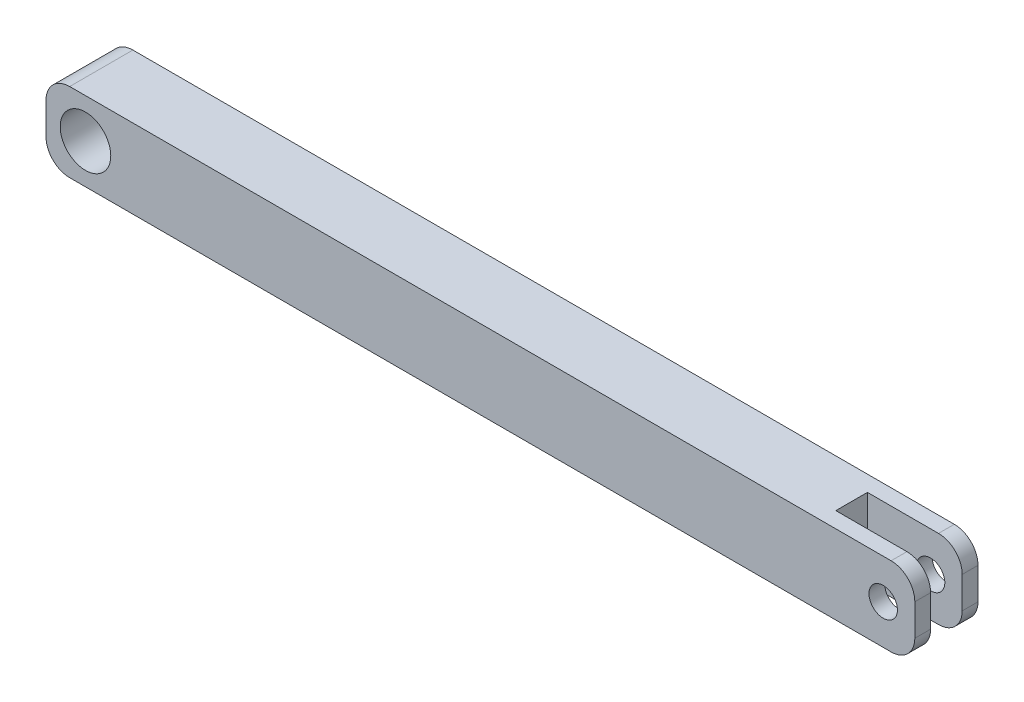
ISO-10303-21;
HEADER;
FILE_DESCRIPTION(('STEP AP214'),'2;1');
FILE_NAME('part.step','',(''),(''),'','','');
FILE_SCHEMA(('AUTOMOTIVE_DESIGN { 1 0 10303 214 1 1 1 1 }'));
ENDSEC;
DATA;
#1=APPLICATION_CONTEXT('core data for automotive mechanical design processes');
#2=APPLICATION_PROTOCOL_DEFINITION('international standard','automotive_design',2000,#1);
#3=PRODUCT_CONTEXT('',#1,'mechanical');
#4=PRODUCT('Part','Part','',(#3));
#5=PRODUCT_RELATED_PRODUCT_CATEGORY('part','',(#4));
#6=PRODUCT_DEFINITION_FORMATION('','',#4);
#7=PRODUCT_DEFINITION_CONTEXT('part definition',#1,'design');
#8=PRODUCT_DEFINITION('design','',#6,#7);
#9=PRODUCT_DEFINITION_SHAPE('','',#8);
#10=(LENGTH_UNIT() NAMED_UNIT(*) SI_UNIT(.MILLI.,.METRE.));
#11=(NAMED_UNIT(*) PLANE_ANGLE_UNIT() SI_UNIT($,.RADIAN.));
#12=(NAMED_UNIT(*) SI_UNIT($,.STERADIAN.) SOLID_ANGLE_UNIT());
#13=UNCERTAINTY_MEASURE_WITH_UNIT(LENGTH_MEASURE(1.E-05),#10,'distance_accuracy_value','');
#14=(GEOMETRIC_REPRESENTATION_CONTEXT(3) GLOBAL_UNCERTAINTY_ASSIGNED_CONTEXT((#13)) GLOBAL_UNIT_ASSIGNED_CONTEXT((#10,
#11,#12)) REPRESENTATION_CONTEXT('',''));
#15=CARTESIAN_POINT('',(0.,0.,0.));
#16=DIRECTION('',(0.,0.,1.));
#17=DIRECTION('',(1.,0.,0.));
#18=AXIS2_PLACEMENT_3D('',#15,#16,#17);
#19=CARTESIAN_POINT('',(55.,5.,3.));
#20=DIRECTION('',(-1.,0.,0.));
#21=DIRECTION('',(0.,0.,1.));
#22=AXIS2_PLACEMENT_3D('',#19,#20,#21);
#23=PLANE('',#22);
#24=DIRECTION('',(0.,0.,-1.));
#25=VECTOR('',#24,1.);
#26=CARTESIAN_POINT('',(55.,1.5,3.));
#27=LINE('',#26,#25);
#28=CARTESIAN_POINT('',(55.,1.5,3.5));
#29=VERTEX_POINT('',#28);
#30=CARTESIAN_POINT('',(55.,1.5,2.5));
#31=VERTEX_POINT('',#30);
#32=EDGE_CURVE('E254',#29,#31,#27,.T.);
#33=ORIENTED_EDGE('',*,*,#32,.T.);
#34=DIRECTION('',(0.,1.,0.));
#35=VECTOR('',#34,1.);
#36=CARTESIAN_POINT('',(55.,5.,2.5));
#37=LINE('',#36,#35);
#38=CARTESIAN_POINT('',(55.,3.5,2.5));
#39=VERTEX_POINT('',#38);
#40=EDGE_CURVE('E185',#31,#39,#37,.T.);
#41=ORIENTED_EDGE('',*,*,#40,.T.);
#42=DIRECTION('',(0.,0.,-1.));
#43=VECTOR('',#42,1.);
#44=CARTESIAN_POINT('',(55.,3.5,3.));
#45=LINE('',#44,#43);
#46=CARTESIAN_POINT('',(55.,3.5,3.5));
#47=VERTEX_POINT('',#46);
#48=EDGE_CURVE('E257',#39,#47,#45,.F.);
#49=ORIENTED_EDGE('',*,*,#48,.T.);
#50=DIRECTION('',(0.,1.,0.));
#51=VECTOR('',#50,1.);
#52=CARTESIAN_POINT('',(55.,1.5,3.5));
#53=LINE('',#52,#51);
#54=EDGE_CURVE('E232',#29,#47,#53,.T.);
#55=ORIENTED_EDGE('',*,*,#54,.F.);
#56=EDGE_LOOP('',(#33,#41,#49,#55));
#57=FACE_BOUND('',#56,.T.);
#58=ADVANCED_FACE('F41',(#57),#23,.F.);
#59=CARTESIAN_POINT('',(53.,2.5,3.001));
#60=DIRECTION('',(0.,0.,-1.));
#61=DIRECTION('',(-1.,0.,0.));
#62=AXIS2_PLACEMENT_3D('',#59,#60,#61);
#63=CYLINDRICAL_SURFACE('',#62,0.900000000000004);
#64=CARTESIAN_POINT('',(53.,2.5,2.5));
#65=DIRECTION('',(0.,0.,1.));
#66=DIRECTION('',(1.,0.,0.));
#67=AXIS2_PLACEMENT_3D('',#64,#65,#66);
#68=CIRCLE('',#67,0.900000000000004);
#69=CARTESIAN_POINT('',(53.9,2.5,2.5));
#70=VERTEX_POINT('',#69);
#71=EDGE_CURVE('E190',#70,#70,#68,.T.);
#72=ORIENTED_EDGE('',*,*,#71,.F.);
#73=EDGE_LOOP('',(#72));
#74=FACE_BOUND('',#73,.T.);
#75=CARTESIAN_POINT('',(53.,2.5,3.5));
#76=DIRECTION('',(0.,0.,1.));
#77=DIRECTION('',(1.,0.,0.));
#78=AXIS2_PLACEMENT_3D('',#75,#76,#77);
#79=CIRCLE('',#78,0.900000000000004);
#80=CARTESIAN_POINT('',(53.9,2.5,3.5));
#81=VERTEX_POINT('',#80);
#82=EDGE_CURVE('E223',#81,#81,#79,.T.);
#83=ORIENTED_EDGE('',*,*,#82,.T.);
#84=EDGE_LOOP('',(#83));
#85=FACE_BOUND('',#84,.T.);
#86=ADVANCED_FACE('F320',(#74,#85),#63,.F.);
#87=CARTESIAN_POINT('',(53.5,3.5,0.));
#88=DIRECTION('',(0.,0.,1.));
#89=DIRECTION('',(1.,0.,0.));
#90=AXIS2_PLACEMENT_3D('',#87,#88,#89);
#91=CYLINDRICAL_SURFACE('',#90,1.5);
#92=CARTESIAN_POINT('',(53.5,3.5,2.5));
#93=DIRECTION('',(0.,0.,1.));
#94=DIRECTION('',(1.,0.,0.));
#95=AXIS2_PLACEMENT_3D('',#92,#93,#94);
#96=CIRCLE('',#95,1.5);
#97=CARTESIAN_POINT('',(53.5,5.,2.5));
#98=VERTEX_POINT('',#97);
#99=EDGE_CURVE('E188',#98,#39,#96,.F.);
#100=ORIENTED_EDGE('',*,*,#99,.F.);
#101=DIRECTION('',(0.,0.,-1.));
#102=VECTOR('',#101,1.);
#103=CARTESIAN_POINT('',(53.5,5.,0.));
#104=LINE('',#103,#102);
#105=CARTESIAN_POINT('',(53.5,5.,3.5));
#106=VERTEX_POINT('',#105);
#107=EDGE_CURVE('E167',#106,#98,#104,.T.);
#108=ORIENTED_EDGE('',*,*,#107,.F.);
#109=CARTESIAN_POINT('',(53.5,3.5,3.5));
#110=DIRECTION('',(0.,0.,1.));
#111=DIRECTION('',(1.,0.,0.));
#112=AXIS2_PLACEMENT_3D('',#109,#110,#111);
#113=CIRCLE('',#112,1.5);
#114=EDGE_CURVE('E235',#47,#106,#113,.T.);
#115=ORIENTED_EDGE('',*,*,#114,.F.);
#116=ORIENTED_EDGE('',*,*,#48,.F.);
#117=EDGE_LOOP('',(#100,#108,#115,#116));
#118=FACE_BOUND('',#117,.T.);
#119=ADVANCED_FACE('F298',(#118),#91,.T.);
#120=CARTESIAN_POINT('',(53.5,1.5,3.));
#121=DIRECTION('',(0.,0.,-1.));
#122=DIRECTION('',(-1.,0.,0.));
#123=AXIS2_PLACEMENT_3D('',#120,#121,#122);
#124=CYLINDRICAL_SURFACE('',#123,1.5);
#125=CARTESIAN_POINT('',(53.5,1.5,2.5));
#126=DIRECTION('',(0.,0.,1.));
#127=DIRECTION('',(1.,0.,0.));
#128=AXIS2_PLACEMENT_3D('',#125,#126,#127);
#129=CIRCLE('',#128,1.5);
#130=CARTESIAN_POINT('',(53.5,0.,2.5));
#131=VERTEX_POINT('',#130);
#132=EDGE_CURVE('E183',#31,#131,#129,.F.);
#133=ORIENTED_EDGE('',*,*,#132,.F.);
#134=ORIENTED_EDGE('',*,*,#32,.F.);
#135=CARTESIAN_POINT('',(53.5,1.5,3.5));
#136=DIRECTION('',(0.,0.,1.));
#137=DIRECTION('',(1.,0.,0.));
#138=AXIS2_PLACEMENT_3D('',#135,#136,#137);
#139=CIRCLE('',#138,1.5);
#140=CARTESIAN_POINT('',(53.5,0.,3.5));
#141=VERTEX_POINT('',#140);
#142=EDGE_CURVE('E229',#141,#29,#139,.T.);
#143=ORIENTED_EDGE('',*,*,#142,.F.);
#144=DIRECTION('',(0.,0.,-1.));
#145=VECTOR('',#144,1.);
#146=CARTESIAN_POINT('',(53.5,0.,0.));
#147=LINE('',#146,#145);
#148=EDGE_CURVE('E55',#131,#141,#147,.F.);
#149=ORIENTED_EDGE('',*,*,#148,.F.);
#150=EDGE_LOOP('',(#133,#134,#143,#149));
#151=FACE_BOUND('',#150,.T.);
#152=ADVANCED_FACE('F292',(#151),#124,.T.);
#153=CARTESIAN_POINT('',(0.,5.,0.));
#154=DIRECTION('',(1.,0.,0.));
#155=DIRECTION('',(0.,0.,-1.));
#156=AXIS2_PLACEMENT_3D('',#153,#154,#155);
#157=PLANE('',#156);
#158=DIRECTION('',(0.,0.,1.));
#159=VECTOR('',#158,1.);
#160=CARTESIAN_POINT('',(0.,3.5,0.));
#161=LINE('',#160,#159);
#162=CARTESIAN_POINT('',(0.,3.5,3.5));
#163=VERTEX_POINT('',#162);
#164=CARTESIAN_POINT('',(0.,3.5,-0.5));
#165=VERTEX_POINT('',#164);
#166=EDGE_CURVE('E265',#163,#165,#161,.F.);
#167=ORIENTED_EDGE('',*,*,#166,.T.);
#168=DIRECTION('',(0.,1.,0.));
#169=VECTOR('',#168,1.);
#170=CARTESIAN_POINT('',(0.,1.5,-0.5));
#171=LINE('',#170,#169);
#172=CARTESIAN_POINT('',(0.,1.5,-0.5));
#173=VERTEX_POINT('',#172);
#174=EDGE_CURVE('E220',#173,#165,#171,.T.);
#175=ORIENTED_EDGE('',*,*,#174,.F.);
#176=DIRECTION('',(0.,0.,1.));
#177=VECTOR('',#176,1.);
#178=CARTESIAN_POINT('',(0.,1.5,0.));
#179=LINE('',#178,#177);
#180=CARTESIAN_POINT('',(0.,1.5,3.5));
#181=VERTEX_POINT('',#180);
#182=EDGE_CURVE('E267',#173,#181,#179,.T.);
#183=ORIENTED_EDGE('',*,*,#182,.T.);
#184=DIRECTION('',(0.,-1.,0.));
#185=VECTOR('',#184,1.);
#186=CARTESIAN_POINT('',(0.,3.5,3.5));
#187=LINE('',#186,#185);
#188=EDGE_CURVE('E244',#163,#181,#187,.T.);
#189=ORIENTED_EDGE('',*,*,#188,.F.);
#190=EDGE_LOOP('',(#167,#175,#183,#189));
#191=FACE_BOUND('',#190,.T.);
#192=ADVANCED_FACE('F310',(#191),#157,.F.);
#193=CARTESIAN_POINT('',(55.,3.5,-0.500000000000004));
#194=VERTEX_POINT('',#193);
#195=CARTESIAN_POINT('',(55.,3.5,0.5));
#196=VERTEX_POINT('',#195);
#197=EDGE_CURVE('E258',#194,#196,#45,.F.);
#198=ORIENTED_EDGE('',*,*,#197,.T.);
#199=DIRECTION('',(0.,-1.,0.));
#200=VECTOR('',#199,1.);
#201=CARTESIAN_POINT('',(55.,5.,0.5));
#202=LINE('',#201,#200);
#203=CARTESIAN_POINT('',(55.,1.5,0.500000000000001));
#204=VERTEX_POINT('',#203);
#205=EDGE_CURVE('E175',#196,#204,#202,.T.);
#206=ORIENTED_EDGE('',*,*,#205,.T.);
#207=CARTESIAN_POINT('',(55.,1.5,-0.500000000000004));
#208=VERTEX_POINT('',#207);
#209=EDGE_CURVE('E253',#204,#208,#27,.T.);
#210=ORIENTED_EDGE('',*,*,#209,.T.);
#211=DIRECTION('',(0.,-1.,0.));
#212=VECTOR('',#211,1.);
#213=CARTESIAN_POINT('',(55.,3.5,-0.500000000000004));
#214=LINE('',#213,#212);
#215=EDGE_CURVE('E208',#194,#208,#214,.T.);
#216=ORIENTED_EDGE('',*,*,#215,.F.);
#217=EDGE_LOOP('',(#198,#206,#210,#216));
#218=FACE_BOUND('',#217,.T.);
#219=ADVANCED_FACE('F277',(#218),#23,.F.);
#220=CARTESIAN_POINT('',(0.,5.,0.));
#221=DIRECTION('',(0.,1.,0.));
#222=DIRECTION('',(0.,0.,1.));
#223=AXIS2_PLACEMENT_3D('',#220,#221,#222);
#224=PLANE('',#223);
#225=DIRECTION('',(0.,0.,1.));
#226=VECTOR('',#225,1.);
#227=CARTESIAN_POINT('',(49.,5.,0.700000000000001));
#228=LINE('',#227,#226);
#229=CARTESIAN_POINT('',(49.,5.,0.500000000000001));
#230=VERTEX_POINT('',#229);
#231=CARTESIAN_POINT('',(49.,5.,2.5));
#232=VERTEX_POINT('',#231);
#233=EDGE_CURVE('E144',#230,#232,#228,.T.);
#234=ORIENTED_EDGE('',*,*,#233,.F.);
#235=DIRECTION('',(-1.,0.,0.));
#236=VECTOR('',#235,1.);
#237=CARTESIAN_POINT('',(55.9534965115397,5.,0.5));
#238=LINE('',#237,#236);
#239=CARTESIAN_POINT('',(53.5,5.,0.500000000000001));
#240=VERTEX_POINT('',#239);
#241=EDGE_CURVE('E162',#240,#230,#238,.T.);
#242=ORIENTED_EDGE('',*,*,#241,.F.);
#243=CARTESIAN_POINT('',(53.5,5.,-0.500000000000004));
#244=VERTEX_POINT('',#243);
#245=EDGE_CURVE('E251',#240,#244,#104,.T.);
#246=ORIENTED_EDGE('',*,*,#245,.T.);
#247=DIRECTION('',(1.,0.,0.));
#248=VECTOR('',#247,1.);
#249=CARTESIAN_POINT('',(1.5,5.,-0.5));
#250=LINE('',#249,#248);
#251=CARTESIAN_POINT('',(1.5,5.,-0.5));
#252=VERTEX_POINT('',#251);
#253=EDGE_CURVE('E202',#252,#244,#250,.T.);
#254=ORIENTED_EDGE('',*,*,#253,.F.);
#255=DIRECTION('',(0.,0.,1.));
#256=VECTOR('',#255,1.);
#257=CARTESIAN_POINT('',(1.5,5.,3.));
#258=LINE('',#257,#256);
#259=CARTESIAN_POINT('',(1.5,5.,3.5));
#260=VERTEX_POINT('',#259);
#261=EDGE_CURVE('E154',#252,#260,#258,.T.);
#262=ORIENTED_EDGE('',*,*,#261,.T.);
#263=DIRECTION('',(-1.,0.,0.));
#264=VECTOR('',#263,1.);
#265=CARTESIAN_POINT('',(53.5,5.,3.5));
#266=LINE('',#265,#264);
#267=EDGE_CURVE('E238',#106,#260,#266,.T.);
#268=ORIENTED_EDGE('',*,*,#267,.F.);
#269=ORIENTED_EDGE('',*,*,#107,.T.);
#270=DIRECTION('',(1.,0.,0.));
#271=VECTOR('',#270,1.);
#272=CARTESIAN_POINT('',(55.9534965115397,5.,2.5));
#273=LINE('',#272,#271);
#274=EDGE_CURVE('E160',#232,#98,#273,.T.);
#275=ORIENTED_EDGE('',*,*,#274,.F.);
#276=EDGE_LOOP('',(#234,#242,#246,#254,#262,#268,#269,#275));
#277=FACE_BOUND('',#276,.T.);
#278=ADVANCED_FACE('F165',(#277),#224,.T.);
#279=CARTESIAN_POINT('',(0.,0.,0.));
#280=DIRECTION('',(0.,1.,0.));
#281=DIRECTION('',(0.,0.,1.));
#282=AXIS2_PLACEMENT_3D('',#279,#280,#281);
#283=PLANE('',#282);
#284=DIRECTION('',(-1.,0.,0.));
#285=VECTOR('',#284,1.);
#286=CARTESIAN_POINT('',(0.,0.,0.500000000000007));
#287=LINE('',#286,#285);
#288=CARTESIAN_POINT('',(53.5,0.,0.500000000000001));
#289=VERTEX_POINT('',#288);
#290=CARTESIAN_POINT('',(49.,0.,0.500000000000001));
#291=VERTEX_POINT('',#290);
#292=EDGE_CURVE('E171',#289,#291,#287,.T.);
#293=ORIENTED_EDGE('',*,*,#292,.T.);
#294=DIRECTION('',(0.,0.,1.));
#295=VECTOR('',#294,1.);
#296=CARTESIAN_POINT('',(49.,0.,0.));
#297=LINE('',#296,#295);
#298=CARTESIAN_POINT('',(49.,0.,2.5));
#299=VERTEX_POINT('',#298);
#300=EDGE_CURVE('E269',#291,#299,#297,.T.);
#301=ORIENTED_EDGE('',*,*,#300,.T.);
#302=DIRECTION('',(1.,0.,0.));
#303=VECTOR('',#302,1.);
#304=CARTESIAN_POINT('',(0.,0.,2.50000000000001));
#305=LINE('',#304,#303);
#306=EDGE_CURVE('E11',#299,#131,#305,.T.);
#307=ORIENTED_EDGE('',*,*,#306,.T.);
#308=ORIENTED_EDGE('',*,*,#148,.T.);
#309=DIRECTION('',(1.,0.,0.));
#310=VECTOR('',#309,1.);
#311=CARTESIAN_POINT('',(1.5,0.,3.5));
#312=LINE('',#311,#310);
#313=CARTESIAN_POINT('',(1.5,0.,3.5));
#314=VERTEX_POINT('',#313);
#315=EDGE_CURVE('E155',#314,#141,#312,.T.);
#316=ORIENTED_EDGE('',*,*,#315,.F.);
#317=DIRECTION('',(0.,0.,1.));
#318=VECTOR('',#317,1.);
#319=CARTESIAN_POINT('',(1.5,0.,0.));
#320=LINE('',#319,#318);
#321=CARTESIAN_POINT('',(1.5,0.,-0.5));
#322=VERTEX_POINT('',#321);
#323=EDGE_CURVE('E63',#314,#322,#320,.F.);
#324=ORIENTED_EDGE('',*,*,#323,.T.);
#325=DIRECTION('',(-1.,0.,0.));
#326=VECTOR('',#325,1.);
#327=CARTESIAN_POINT('',(53.5,0.,-0.500000000000004));
#328=LINE('',#327,#326);
#329=CARTESIAN_POINT('',(53.5,0.,-0.500000000000004));
#330=VERTEX_POINT('',#329);
#331=EDGE_CURVE('E214',#330,#322,#328,.T.);
#332=ORIENTED_EDGE('',*,*,#331,.F.);
#333=EDGE_CURVE('E262',#330,#289,#147,.F.);
#334=ORIENTED_EDGE('',*,*,#333,.T.);
#335=EDGE_LOOP('',(#293,#301,#307,#308,#316,#324,#332,#334));
#336=FACE_BOUND('',#335,.T.);
#337=ADVANCED_FACE('F285',(#336),#283,.F.);
#338=CARTESIAN_POINT('',(2.5,2.5,-0.00100000000000013));
#339=DIRECTION('',(0.,0.,1.));
#340=DIRECTION('',(1.,0.,0.));
#341=AXIS2_PLACEMENT_3D('',#338,#339,#340);
#342=CYLINDRICAL_SURFACE('',#341,1.6);
#343=CARTESIAN_POINT('',(2.5,2.5,3.5));
#344=DIRECTION('',(0.,0.,1.));
#345=DIRECTION('',(1.,0.,0.));
#346=AXIS2_PLACEMENT_3D('',#343,#344,#345);
#347=CIRCLE('',#346,1.6);
#348=CARTESIAN_POINT('',(4.1,2.5,3.5));
#349=VERTEX_POINT('',#348);
#350=EDGE_CURVE('E226',#349,#349,#347,.T.);
#351=CARTESIAN_POINT('',(2.5,2.5,-0.5));
#352=DIRECTION('',(0.,0.,-1.));
#353=DIRECTION('',(-1.,0.,0.));
#354=AXIS2_PLACEMENT_3D('',#351,#352,#353);
#355=CIRCLE('',#354,1.6);
#356=CARTESIAN_POINT('',(4.1,2.5,-0.5));
#357=VERTEX_POINT('',#356);
#358=EDGE_CURVE('E193',#357,#357,#355,.T.);
#359=CARTESIAN_POINT('',(4.1,2.5,3.5));
#360=CARTESIAN_POINT('',(4.1,2.5,3.45833333333333));
#361=CARTESIAN_POINT('',(4.1,2.5,3.41666666666667));
#362=CARTESIAN_POINT('',(4.1,2.5,3.33333333333333));
#363=CARTESIAN_POINT('',(4.1,2.5,3.29166666666667));
#364=CARTESIAN_POINT('',(4.1,2.5,3.20833333333333));
#365=CARTESIAN_POINT('',(4.1,2.5,3.16666666666667));
#366=CARTESIAN_POINT('',(4.1,2.5,3.08333333333333));
#367=CARTESIAN_POINT('',(4.1,2.5,3.04166666666667));
#368=CARTESIAN_POINT('',(4.1,2.5,2.95833333333333));
#369=CARTESIAN_POINT('',(4.1,2.5,2.91666666666667));
#370=CARTESIAN_POINT('',(4.1,2.5,2.83333333333333));
#371=CARTESIAN_POINT('',(4.1,2.5,2.79166666666667));
#372=CARTESIAN_POINT('',(4.1,2.5,2.70833333333333));
#373=CARTESIAN_POINT('',(4.1,2.5,2.66666666666667));
#374=CARTESIAN_POINT('',(4.1,2.5,2.58333333333333));
#375=CARTESIAN_POINT('',(4.1,2.5,2.54166666666667));
#376=CARTESIAN_POINT('',(4.1,2.5,2.45833333333333));
#377=CARTESIAN_POINT('',(4.1,2.5,2.41666666666667));
#378=CARTESIAN_POINT('',(4.1,2.5,2.33333333333333));
#379=CARTESIAN_POINT('',(4.1,2.5,2.29166666666667));
#380=CARTESIAN_POINT('',(4.1,2.5,2.20833333333333));
#381=CARTESIAN_POINT('',(4.1,2.5,2.16666666666667));
#382=CARTESIAN_POINT('',(4.1,2.5,2.08333333333333));
#383=CARTESIAN_POINT('',(4.1,2.5,2.04166666666667));
#384=CARTESIAN_POINT('',(4.1,2.5,1.95833333333333));
#385=CARTESIAN_POINT('',(4.1,2.5,1.91666666666667));
#386=CARTESIAN_POINT('',(4.1,2.5,1.83333333333333));
#387=CARTESIAN_POINT('',(4.1,2.5,1.79166666666667));
#388=CARTESIAN_POINT('',(4.1,2.5,1.70833333333333));
#389=CARTESIAN_POINT('',(4.1,2.5,1.66666666666667));
#390=CARTESIAN_POINT('',(4.1,2.5,1.58333333333333));
#391=CARTESIAN_POINT('',(4.1,2.5,1.54166666666667));
#392=CARTESIAN_POINT('',(4.1,2.5,1.45833333333333));
#393=CARTESIAN_POINT('',(4.1,2.5,1.41666666666667));
#394=CARTESIAN_POINT('',(4.1,2.5,1.33333333333333));
#395=CARTESIAN_POINT('',(4.1,2.5,1.29166666666667));
#396=CARTESIAN_POINT('',(4.1,2.5,1.20833333333333));
#397=CARTESIAN_POINT('',(4.1,2.5,1.16666666666667));
#398=CARTESIAN_POINT('',(4.1,2.5,1.08333333333333));
#399=CARTESIAN_POINT('',(4.1,2.5,1.04166666666667));
#400=CARTESIAN_POINT('',(4.1,2.5,0.958333333333333));
#401=CARTESIAN_POINT('',(4.1,2.5,0.916666666666666));
#402=CARTESIAN_POINT('',(4.1,2.5,0.833333333333333));
#403=CARTESIAN_POINT('',(4.1,2.5,0.791666666666666));
#404=CARTESIAN_POINT('',(4.1,2.5,0.708333333333333));
#405=CARTESIAN_POINT('',(4.1,2.5,0.666666666666666));
#406=CARTESIAN_POINT('',(4.1,2.5,0.583333333333333));
#407=CARTESIAN_POINT('',(4.1,2.5,0.541666666666666));
#408=CARTESIAN_POINT('',(4.1,2.5,0.458333333333333));
#409=CARTESIAN_POINT('',(4.1,2.5,0.416666666666666));
#410=CARTESIAN_POINT('',(4.1,2.5,0.333333333333333));
#411=CARTESIAN_POINT('',(4.1,2.5,0.291666666666666));
#412=CARTESIAN_POINT('',(4.1,2.5,0.208333333333333));
#413=CARTESIAN_POINT('',(4.1,2.5,0.166666666666666));
#414=CARTESIAN_POINT('',(4.1,2.5,0.083333333333333));
#415=CARTESIAN_POINT('',(4.1,2.5,0.0416666666666663));
#416=CARTESIAN_POINT('',(4.1,2.5,-0.0416666666666671));
#417=CARTESIAN_POINT('',(4.1,2.5,-0.0833333333333338));
#418=CARTESIAN_POINT('',(4.1,2.5,-0.166666666666667));
#419=CARTESIAN_POINT('',(4.1,2.5,-0.208333333333334));
#420=CARTESIAN_POINT('',(4.1,2.5,-0.291666666666667));
#421=CARTESIAN_POINT('',(4.1,2.5,-0.333333333333334));
#422=CARTESIAN_POINT('',(4.1,2.5,-0.416666666666667));
#423=CARTESIAN_POINT('',(4.1,2.5,-0.458333333333334));
#424=CARTESIAN_POINT('',(4.1,2.5,-0.5));
#425=B_SPLINE_CURVE_WITH_KNOTS('',3,(#359,#360,#361,#362,#363,#364,#365,#366,#367,#368,#369,
#370,#371,#372,#373,#374,#375,#376,#377,#378,#379,#380,#381,#382,#383,#384,#385,#386,#387,#388,
#389,#390,#391,#392,#393,#394,#395,#396,#397,#398,#399,#400,#401,#402,#403,#404,#405,#406,#407,
#408,#409,#410,#411,#412,#413,#414,#415,#416,#417,#418,#419,#420,#421,#422,#423,#424),
.UNSPECIFIED.,.F.,.F.,(4,2,2,2,2,2,2,2,2,2,2,2,2,2,2,2,2,2,2,2,2,2,2,2,2,2,2,2,2,2,2,2,4),(0.,
0.125,0.25,0.375,0.5,0.625,0.75,0.875,1.,1.125,1.25,1.375,1.5,1.625,1.75,1.875,2.,2.125,2.25,
2.375,2.5,2.625,2.75,2.875,3.,3.125,3.25,3.375,3.5,3.625,3.75,3.875,4.),.UNSPECIFIED.);
#426=EDGE_CURVE('BSEAM346',#349,#357,#425,.T.);
#427=ORIENTED_EDGE('',*,*,#350,.T.);
#428=ORIENTED_EDGE('',*,*,#358,.T.);
#429=ORIENTED_EDGE('',*,*,#426,.T.);
#430=ORIENTED_EDGE('',*,*,#426,.F.);
#431=EDGE_LOOP('',(#427,#429,#428,#430));
#432=FACE_BOUND('',#431,.T.);
#433=ADVANCED_FACE('F346',(#432),#342,.F.);
#434=CARTESIAN_POINT('',(53.,2.5,0.500000000000001));
#435=DIRECTION('',(0.,0.,-1.));
#436=DIRECTION('',(-1.,0.,0.));
#437=AXIS2_PLACEMENT_3D('',#434,#435,#436);
#438=CIRCLE('',#437,0.900000000000004);
#439=CARTESIAN_POINT('',(52.1,2.5,0.500000000000001));
#440=VERTEX_POINT('',#439);
#441=EDGE_CURVE('E180',#440,#440,#438,.T.);
#442=ORIENTED_EDGE('',*,*,#441,.F.);
#443=EDGE_LOOP('',(#442));
#444=FACE_BOUND('',#443,.T.);
#445=CARTESIAN_POINT('',(53.,2.5,-0.500000000000004));
#446=DIRECTION('',(0.,0.,-1.));
#447=DIRECTION('',(-1.,0.,0.));
#448=AXIS2_PLACEMENT_3D('',#445,#446,#447);
#449=CIRCLE('',#448,0.900000000000004);
#450=CARTESIAN_POINT('',(52.1,2.5,-0.500000000000004));
#451=VERTEX_POINT('',#450);
#452=EDGE_CURVE('E196',#451,#451,#449,.T.);
#453=ORIENTED_EDGE('',*,*,#452,.T.);
#454=EDGE_LOOP('',(#453));
#455=FACE_BOUND('',#454,.T.);
#456=ADVANCED_FACE('F328',(#444,#455),#63,.F.);
#457=CARTESIAN_POINT('',(53.5,3.5,0.500000000000001));
#458=DIRECTION('',(0.,0.,-1.));
#459=DIRECTION('',(-1.,0.,0.));
#460=AXIS2_PLACEMENT_3D('',#457,#458,#459);
#461=CIRCLE('',#460,1.5);
#462=EDGE_CURVE('E178',#196,#240,#461,.F.);
#463=ORIENTED_EDGE('',*,*,#462,.F.);
#464=ORIENTED_EDGE('',*,*,#197,.F.);
#465=CARTESIAN_POINT('',(53.5,3.5,-0.500000000000004));
#466=DIRECTION('',(0.,0.,-1.));
#467=DIRECTION('',(-1.,0.,0.));
#468=AXIS2_PLACEMENT_3D('',#465,#466,#467);
#469=CIRCLE('',#468,1.5);
#470=EDGE_CURVE('E205',#244,#194,#469,.T.);
#471=ORIENTED_EDGE('',*,*,#470,.F.);
#472=ORIENTED_EDGE('',*,*,#245,.F.);
#473=EDGE_LOOP('',(#463,#464,#471,#472));
#474=FACE_BOUND('',#473,.T.);
#475=ADVANCED_FACE('F303',(#474),#91,.T.);
#476=CARTESIAN_POINT('',(53.5,1.5,0.500000000000001));
#477=DIRECTION('',(0.,0.,-1.));
#478=DIRECTION('',(-1.,0.,0.));
#479=AXIS2_PLACEMENT_3D('',#476,#477,#478);
#480=CIRCLE('',#479,1.5);
#481=EDGE_CURVE('E49',#289,#204,#480,.F.);
#482=ORIENTED_EDGE('',*,*,#481,.F.);
#483=ORIENTED_EDGE('',*,*,#333,.F.);
#484=CARTESIAN_POINT('',(53.5,1.5,-0.500000000000004));
#485=DIRECTION('',(0.,0.,-1.));
#486=DIRECTION('',(-1.,0.,0.));
#487=AXIS2_PLACEMENT_3D('',#484,#485,#486);
#488=CIRCLE('',#487,1.5);
#489=EDGE_CURVE('E211',#208,#330,#488,.T.);
#490=ORIENTED_EDGE('',*,*,#489,.F.);
#491=ORIENTED_EDGE('',*,*,#209,.F.);
#492=EDGE_LOOP('',(#482,#483,#490,#491));
#493=FACE_BOUND('',#492,.T.);
#494=ADVANCED_FACE('F280',(#493),#124,.T.);
#495=CARTESIAN_POINT('',(1.5,1.5,0.));
#496=DIRECTION('',(0.,0.,1.));
#497=DIRECTION('',(1.,0.,0.));
#498=AXIS2_PLACEMENT_3D('',#495,#496,#497);
#499=CYLINDRICAL_SURFACE('',#498,1.5);
#500=ORIENTED_EDGE('',*,*,#182,.F.);
#501=CARTESIAN_POINT('',(1.5,1.5,-0.5));
#502=DIRECTION('',(0.,0.,-1.));
#503=DIRECTION('',(-1.,0.,0.));
#504=AXIS2_PLACEMENT_3D('',#501,#502,#503);
#505=CIRCLE('',#504,1.5);
#506=EDGE_CURVE('E217',#322,#173,#505,.T.);
#507=ORIENTED_EDGE('',*,*,#506,.F.);
#508=ORIENTED_EDGE('',*,*,#323,.F.);
#509=CARTESIAN_POINT('',(1.5,1.5,3.5));
#510=DIRECTION('',(0.,0.,1.));
#511=DIRECTION('',(1.,0.,0.));
#512=AXIS2_PLACEMENT_3D('',#509,#510,#511);
#513=CIRCLE('',#512,1.5);
#514=EDGE_CURVE('E247',#181,#314,#513,.T.);
#515=ORIENTED_EDGE('',*,*,#514,.F.);
#516=EDGE_LOOP('',(#500,#507,#508,#515));
#517=FACE_BOUND('',#516,.T.);
#518=ADVANCED_FACE('F311',(#517),#499,.T.);
#519=CARTESIAN_POINT('',(1.5,3.5,0.));
#520=DIRECTION('',(0.,0.,-1.));
#521=DIRECTION('',(-1.,0.,0.));
#522=AXIS2_PLACEMENT_3D('',#519,#520,#521);
#523=CYLINDRICAL_SURFACE('',#522,1.5);
#524=ORIENTED_EDGE('',*,*,#261,.F.);
#525=CARTESIAN_POINT('',(1.5,3.5,-0.5));
#526=DIRECTION('',(0.,0.,-1.));
#527=DIRECTION('',(-1.,0.,0.));
#528=AXIS2_PLACEMENT_3D('',#525,#526,#527);
#529=CIRCLE('',#528,1.5);
#530=EDGE_CURVE('E199',#165,#252,#529,.T.);
#531=ORIENTED_EDGE('',*,*,#530,.F.);
#532=ORIENTED_EDGE('',*,*,#166,.F.);
#533=CARTESIAN_POINT('',(1.5,3.5,3.5));
#534=DIRECTION('',(0.,0.,1.));
#535=DIRECTION('',(1.,0.,0.));
#536=AXIS2_PLACEMENT_3D('',#533,#534,#535);
#537=CIRCLE('',#536,1.5);
#538=EDGE_CURVE('E241',#260,#163,#537,.T.);
#539=ORIENTED_EDGE('',*,*,#538,.F.);
#540=EDGE_LOOP('',(#524,#531,#532,#539));
#541=FACE_BOUND('',#540,.T.);
#542=ADVANCED_FACE('F43',(#541),#523,.T.);
#543=CARTESIAN_POINT('',(49.,-5.,0.700000000000001));
#544=DIRECTION('',(-1.,0.,0.));
#545=DIRECTION('',(0.,0.,1.));
#546=AXIS2_PLACEMENT_3D('',#543,#544,#545);
#547=PLANE('',#546);
#548=ORIENTED_EDGE('',*,*,#300,.F.);
#549=DIRECTION('',(0.,1.,0.));
#550=VECTOR('',#549,1.);
#551=CARTESIAN_POINT('',(49.,-5.,0.500000000000001));
#552=LINE('',#551,#550);
#553=EDGE_CURVE('E149',#291,#230,#552,.T.);
#554=ORIENTED_EDGE('',*,*,#553,.T.);
#555=ORIENTED_EDGE('',*,*,#233,.T.);
#556=DIRECTION('',(0.,1.,0.));
#557=VECTOR('',#556,1.);
#558=CARTESIAN_POINT('',(49.,-5.,2.5));
#559=LINE('',#558,#557);
#560=EDGE_CURVE('E147',#299,#232,#559,.T.);
#561=ORIENTED_EDGE('',*,*,#560,.F.);
#562=EDGE_LOOP('',(#548,#554,#555,#561));
#563=FACE_BOUND('',#562,.T.);
#564=ADVANCED_FACE('F146',(#563),#547,.F.);
#565=CARTESIAN_POINT('',(53.5,1.5,3.5));
#566=DIRECTION('',(0.,0.,1.));
#567=DIRECTION('',(1.,0.,0.));
#568=AXIS2_PLACEMENT_3D('',#565,#566,#567);
#569=PLANE('',#568);
#570=ORIENTED_EDGE('',*,*,#350,.F.);
#571=EDGE_LOOP('',(#570));
#572=FACE_BOUND('',#571,.T.);
#573=ORIENTED_EDGE('',*,*,#142,.T.);
#574=ORIENTED_EDGE('',*,*,#54,.T.);
#575=ORIENTED_EDGE('',*,*,#114,.T.);
#576=ORIENTED_EDGE('',*,*,#267,.T.);
#577=ORIENTED_EDGE('',*,*,#538,.T.);
#578=ORIENTED_EDGE('',*,*,#188,.T.);
#579=ORIENTED_EDGE('',*,*,#514,.T.);
#580=ORIENTED_EDGE('',*,*,#315,.T.);
#581=EDGE_LOOP('',(#573,#574,#575,#576,#577,#578,#579,#580));
#582=FACE_BOUND('',#581,.T.);
#583=ORIENTED_EDGE('',*,*,#82,.F.);
#584=EDGE_LOOP('',(#583));
#585=FACE_BOUND('',#584,.T.);
#586=ADVANCED_FACE('F288',(#572,#582,#585),#569,.T.);
#587=CARTESIAN_POINT('',(1.5,3.5,-0.5));
#588=DIRECTION('',(0.,0.,-1.));
#589=DIRECTION('',(-1.,0.,0.));
#590=AXIS2_PLACEMENT_3D('',#587,#588,#589);
#591=PLANE('',#590);
#592=ORIENTED_EDGE('',*,*,#452,.F.);
#593=EDGE_LOOP('',(#592));
#594=FACE_BOUND('',#593,.T.);
#595=ORIENTED_EDGE('',*,*,#530,.T.);
#596=ORIENTED_EDGE('',*,*,#253,.T.);
#597=ORIENTED_EDGE('',*,*,#470,.T.);
#598=ORIENTED_EDGE('',*,*,#215,.T.);
#599=ORIENTED_EDGE('',*,*,#489,.T.);
#600=ORIENTED_EDGE('',*,*,#331,.T.);
#601=ORIENTED_EDGE('',*,*,#506,.T.);
#602=ORIENTED_EDGE('',*,*,#174,.T.);
#603=EDGE_LOOP('',(#595,#596,#597,#598,#599,#600,#601,#602));
#604=FACE_BOUND('',#603,.T.);
#605=ORIENTED_EDGE('',*,*,#358,.F.);
#606=EDGE_LOOP('',(#605));
#607=FACE_BOUND('',#606,.T.);
#608=ADVANCED_FACE('F283',(#594,#604,#607),#591,.T.);
#609=CARTESIAN_POINT('',(55.9534965115397,-5.,0.5));
#610=DIRECTION('',(0.,0.,-1.));
#611=DIRECTION('',(-1.,0.,0.));
#612=AXIS2_PLACEMENT_3D('',#609,#610,#611);
#613=PLANE('',#612);
#614=ORIENTED_EDGE('',*,*,#441,.T.);
#615=EDGE_LOOP('',(#614));
#616=FACE_BOUND('',#615,.T.);
#617=ORIENTED_EDGE('',*,*,#462,.T.);
#618=ORIENTED_EDGE('',*,*,#241,.T.);
#619=ORIENTED_EDGE('',*,*,#553,.F.);
#620=ORIENTED_EDGE('',*,*,#292,.F.);
#621=ORIENTED_EDGE('',*,*,#481,.T.);
#622=ORIENTED_EDGE('',*,*,#205,.F.);
#623=EDGE_LOOP('',(#617,#618,#619,#620,#621,#622));
#624=FACE_BOUND('',#623,.T.);
#625=ADVANCED_FACE('F272',(#616,#624),#613,.F.);
#626=CARTESIAN_POINT('',(55.9534965115397,-5.,2.5));
#627=DIRECTION('',(0.,0.,1.));
#628=DIRECTION('',(1.,0.,0.));
#629=AXIS2_PLACEMENT_3D('',#626,#627,#628);
#630=PLANE('',#629);
#631=ORIENTED_EDGE('',*,*,#71,.T.);
#632=EDGE_LOOP('',(#631));
#633=FACE_BOUND('',#632,.T.);
#634=ORIENTED_EDGE('',*,*,#99,.T.);
#635=ORIENTED_EDGE('',*,*,#40,.F.);
#636=ORIENTED_EDGE('',*,*,#132,.T.);
#637=ORIENTED_EDGE('',*,*,#306,.F.);
#638=ORIENTED_EDGE('',*,*,#560,.T.);
#639=ORIENTED_EDGE('',*,*,#274,.T.);
#640=EDGE_LOOP('',(#634,#635,#636,#637,#638,#639));
#641=FACE_BOUND('',#640,.T.);
#642=ADVANCED_FACE('F159',(#633,#641),#630,.F.);
#643=CLOSED_SHELL('',(#58,#86,#119,#152,#192,#219,#278,#337,#433,#456,#475,#494,#518,#542,#564,
#586,#608,#625,#642));
#644=MANIFOLD_SOLID_BREP('B2',#643);
#645=ADVANCED_BREP_SHAPE_REPRESENTATION('',(#18,#644),#14);
#646=SHAPE_DEFINITION_REPRESENTATION(#9,#645);
ENDSEC;
END-ISO-10303-21;
